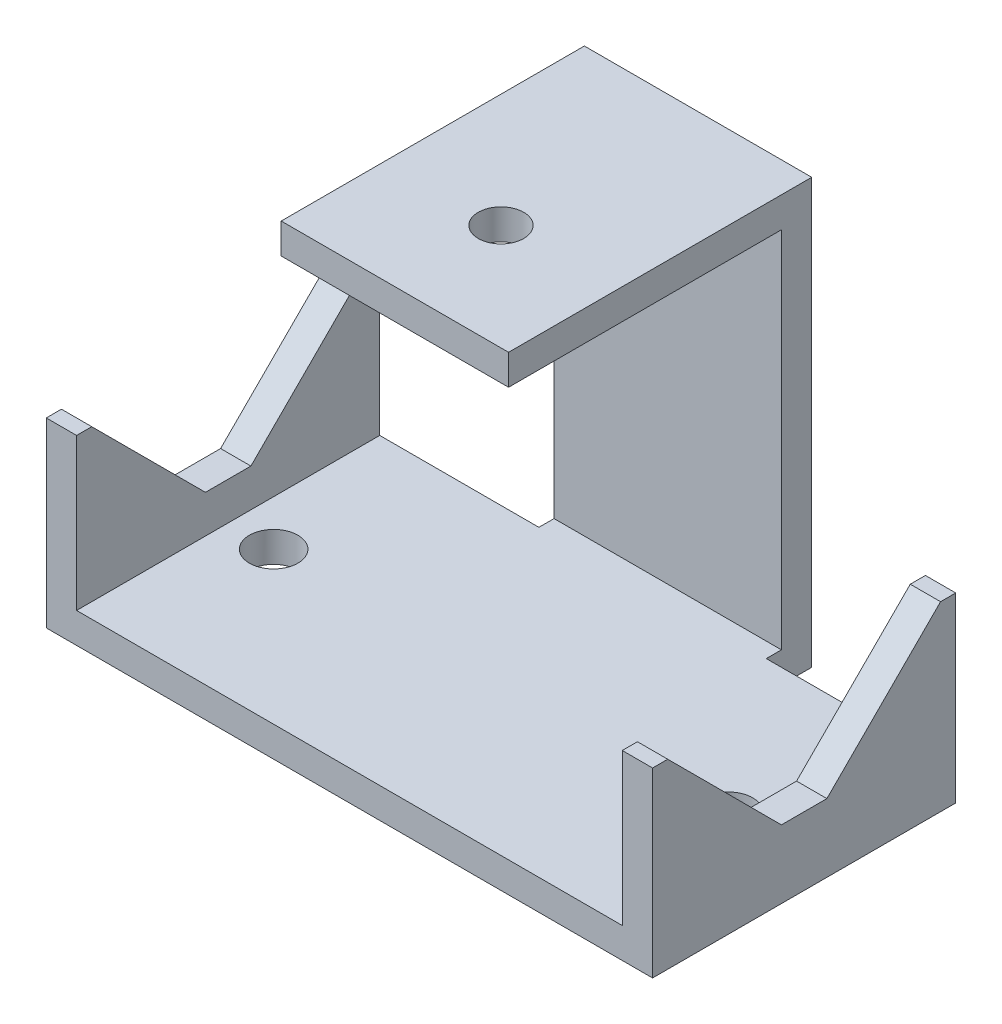
ISO-10303-21;
HEADER;
FILE_DESCRIPTION(('STEP AP214'),'2;1');
FILE_NAME('part.step','',(''),(''),'','','');
FILE_SCHEMA(('AUTOMOTIVE_DESIGN { 1 0 10303 214 1 1 1 1 }'));
ENDSEC;
DATA;
#1=APPLICATION_CONTEXT('core data for automotive mechanical design processes');
#2=APPLICATION_PROTOCOL_DEFINITION('international standard','automotive_design',2000,#1);
#3=PRODUCT_CONTEXT('',#1,'mechanical');
#4=PRODUCT('Part','Part','',(#3));
#5=PRODUCT_RELATED_PRODUCT_CATEGORY('part','',(#4));
#6=PRODUCT_DEFINITION_FORMATION('','',#4);
#7=PRODUCT_DEFINITION_CONTEXT('part definition',#1,'design');
#8=PRODUCT_DEFINITION('design','',#6,#7);
#9=PRODUCT_DEFINITION_SHAPE('','',#8);
#10=(LENGTH_UNIT() NAMED_UNIT(*) SI_UNIT(.MILLI.,.METRE.));
#11=(NAMED_UNIT(*) PLANE_ANGLE_UNIT() SI_UNIT($,.RADIAN.));
#12=(NAMED_UNIT(*) SI_UNIT($,.STERADIAN.) SOLID_ANGLE_UNIT());
#13=UNCERTAINTY_MEASURE_WITH_UNIT(LENGTH_MEASURE(1.E-05),#10,'distance_accuracy_value','');
#14=(GEOMETRIC_REPRESENTATION_CONTEXT(3) GLOBAL_UNCERTAINTY_ASSIGNED_CONTEXT((#13)) GLOBAL_UNIT_ASSIGNED_CONTEXT((#10,
#11,#12)) REPRESENTATION_CONTEXT('',''));
#15=CARTESIAN_POINT('',(0.,0.,0.));
#16=DIRECTION('',(0.,0.,1.));
#17=DIRECTION('',(1.,0.,0.));
#18=AXIS2_PLACEMENT_3D('',#15,#16,#17);
#19=CARTESIAN_POINT('',(0.,0.,-11.));
#20=DIRECTION('',(0.,0.,1.));
#21=DIRECTION('',(1.,0.,0.));
#22=AXIS2_PLACEMENT_3D('',#19,#20,#21);
#23=PLANE('',#22);
#24=DIRECTION('',(0.,-1.,0.));
#25=VECTOR('',#24,1.);
#26=CARTESIAN_POINT('',(7.5,0.,-11.));
#27=LINE('',#26,#25);
#28=CARTESIAN_POINT('',(7.5,26.,-11.));
#29=VERTEX_POINT('',#28);
#30=CARTESIAN_POINT('',(7.5,2.,-11.));
#31=VERTEX_POINT('',#30);
#32=EDGE_CURVE('E320',#29,#31,#27,.T.);
#33=ORIENTED_EDGE('',*,*,#32,.F.);
#34=DIRECTION('',(-1.,0.,0.));
#35=VECTOR('',#34,1.);
#36=CARTESIAN_POINT('',(0.,26.,-11.));
#37=LINE('',#36,#35);
#38=CARTESIAN_POINT('',(-7.5,26.,-11.));
#39=VERTEX_POINT('',#38);
#40=EDGE_CURVE('E11',#29,#39,#37,.T.);
#41=ORIENTED_EDGE('',*,*,#40,.T.);
#42=DIRECTION('',(0.,1.,0.));
#43=VECTOR('',#42,1.);
#44=CARTESIAN_POINT('',(-7.5,0.,-11.));
#45=LINE('',#44,#43);
#46=CARTESIAN_POINT('',(-7.5,2.,-11.));
#47=VERTEX_POINT('',#46);
#48=EDGE_CURVE('E199',#47,#39,#45,.T.);
#49=ORIENTED_EDGE('',*,*,#48,.F.);
#50=DIRECTION('',(-1.,0.,0.));
#51=VECTOR('',#50,1.);
#52=CARTESIAN_POINT('',(0.,2.,-11.));
#53=LINE('',#52,#51);
#54=EDGE_CURVE('E329',#31,#47,#53,.T.);
#55=ORIENTED_EDGE('',*,*,#54,.F.);
#56=EDGE_LOOP('',(#33,#41,#49,#55));
#57=FACE_BOUND('',#56,.T.);
#58=ADVANCED_FACE('F32',(#57),#23,.T.);
#59=CARTESIAN_POINT('',(20.,2.,10.));
#60=DIRECTION('',(-1.,0.,0.));
#61=DIRECTION('',(0.,0.,1.));
#62=AXIS2_PLACEMENT_3D('',#59,#60,#61);
#63=PLANE('',#62);
#64=DIRECTION('',(0.,0.,-1.));
#65=VECTOR('',#64,1.);
#66=CARTESIAN_POINT('',(20.,0.,10.));
#67=LINE('',#66,#65);
#68=CARTESIAN_POINT('',(20.,0.,10.));
#69=VERTEX_POINT('',#68);
#70=CARTESIAN_POINT('',(20.,0.,-10.));
#71=VERTEX_POINT('',#70);
#72=EDGE_CURVE('E332',#69,#71,#67,.T.);
#73=ORIENTED_EDGE('',*,*,#72,.T.);
#74=DIRECTION('',(0.,-1.,0.));
#75=VECTOR('',#74,1.);
#76=CARTESIAN_POINT('',(20.,2.,-10.));
#77=LINE('',#76,#75);
#78=CARTESIAN_POINT('',(20.,12.,-10.));
#79=VERTEX_POINT('',#78);
#80=EDGE_CURVE('E40',#79,#71,#77,.T.);
#81=ORIENTED_EDGE('',*,*,#80,.F.);
#82=DIRECTION('',(0.,0.,-1.));
#83=VECTOR('',#82,1.);
#84=CARTESIAN_POINT('',(20.,12.,-10.));
#85=LINE('',#84,#83);
#86=CARTESIAN_POINT('',(20.,12.,-9.));
#87=VERTEX_POINT('',#86);
#88=EDGE_CURVE('E222',#87,#79,#85,.T.);
#89=ORIENTED_EDGE('',*,*,#88,.F.);
#90=DIRECTION('',(0.,0.70710678118655,-0.707106781186545));
#91=VECTOR('',#90,1.);
#92=CARTESIAN_POINT('',(20.,12.,-9.));
#93=LINE('',#92,#91);
#94=CARTESIAN_POINT('',(20.,4.49999999999995,-1.5));
#95=VERTEX_POINT('',#94);
#96=EDGE_CURVE('E243',#95,#87,#93,.T.);
#97=ORIENTED_EDGE('',*,*,#96,.F.);
#98=DIRECTION('',(0.,0.,-1.));
#99=VECTOR('',#98,1.);
#100=CARTESIAN_POINT('',(20.,4.49999999999995,-1.5));
#101=LINE('',#100,#99);
#102=CARTESIAN_POINT('',(20.,4.49999999999995,1.5));
#103=VERTEX_POINT('',#102);
#104=EDGE_CURVE('E245',#103,#95,#101,.T.);
#105=ORIENTED_EDGE('',*,*,#104,.F.);
#106=DIRECTION('',(0.,-0.70710678118655,-0.707106781186545));
#107=VECTOR('',#106,1.);
#108=CARTESIAN_POINT('',(20.,4.49999999999995,1.5));
#109=LINE('',#108,#107);
#110=CARTESIAN_POINT('',(20.,12.,9.));
#111=VERTEX_POINT('',#110);
#112=EDGE_CURVE('E247',#111,#103,#109,.T.);
#113=ORIENTED_EDGE('',*,*,#112,.F.);
#114=DIRECTION('',(0.,0.,-1.));
#115=VECTOR('',#114,1.);
#116=CARTESIAN_POINT('',(20.,12.,9.));
#117=LINE('',#116,#115);
#118=CARTESIAN_POINT('',(20.,12.,10.));
#119=VERTEX_POINT('',#118);
#120=EDGE_CURVE('E228',#119,#111,#117,.T.);
#121=ORIENTED_EDGE('',*,*,#120,.F.);
#122=DIRECTION('',(0.,-1.,0.));
#123=VECTOR('',#122,1.);
#124=CARTESIAN_POINT('',(20.,2.,10.));
#125=LINE('',#124,#123);
#126=EDGE_CURVE('E344',#119,#69,#125,.T.);
#127=ORIENTED_EDGE('',*,*,#126,.T.);
#128=EDGE_LOOP('',(#73,#81,#89,#97,#105,#113,#121,#127));
#129=FACE_BOUND('',#128,.T.);
#130=ADVANCED_FACE('F34',(#129),#63,.F.);
#131=CARTESIAN_POINT('',(7.5,2.,-10.));
#132=DIRECTION('',(0.,0.,1.));
#133=DIRECTION('',(1.,0.,0.));
#134=AXIS2_PLACEMENT_3D('',#131,#132,#133);
#135=PLANE('',#134);
#136=DIRECTION('',(-1.,0.,0.));
#137=VECTOR('',#136,1.);
#138=CARTESIAN_POINT('',(7.5,2.,-10.));
#139=LINE('',#138,#137);
#140=CARTESIAN_POINT('',(18.,2.,-10.));
#141=VERTEX_POINT('',#140);
#142=CARTESIAN_POINT('',(7.5,2.,-10.));
#143=VERTEX_POINT('',#142);
#144=EDGE_CURVE('E333',#141,#143,#139,.T.);
#145=ORIENTED_EDGE('',*,*,#144,.F.);
#146=DIRECTION('',(0.,-1.,0.));
#147=VECTOR('',#146,1.);
#148=CARTESIAN_POINT('',(18.,0.,-10.));
#149=LINE('',#148,#147);
#150=CARTESIAN_POINT('',(18.,12.,-10.));
#151=VERTEX_POINT('',#150);
#152=EDGE_CURVE('E224',#151,#141,#149,.T.);
#153=ORIENTED_EDGE('',*,*,#152,.F.);
#154=DIRECTION('',(1.,0.,0.));
#155=VECTOR('',#154,1.);
#156=CARTESIAN_POINT('',(18.,12.,-10.));
#157=LINE('',#156,#155);
#158=EDGE_CURVE('E240',#151,#79,#157,.T.);
#159=ORIENTED_EDGE('',*,*,#158,.T.);
#160=ORIENTED_EDGE('',*,*,#80,.T.);
#161=DIRECTION('',(-1.,0.,0.));
#162=VECTOR('',#161,1.);
#163=CARTESIAN_POINT('',(7.5,0.,-10.));
#164=LINE('',#163,#162);
#165=CARTESIAN_POINT('',(7.5,0.,-10.));
#166=VERTEX_POINT('',#165);
#167=EDGE_CURVE('E347',#71,#166,#164,.T.);
#168=ORIENTED_EDGE('',*,*,#167,.T.);
#169=DIRECTION('',(0.,-1.,0.));
#170=VECTOR('',#169,1.);
#171=CARTESIAN_POINT('',(7.5,2.,-10.));
#172=LINE('',#171,#170);
#173=EDGE_CURVE('E377',#143,#166,#172,.T.);
#174=ORIENTED_EDGE('',*,*,#173,.F.);
#175=EDGE_LOOP('',(#145,#153,#159,#160,#168,#174));
#176=FACE_BOUND('',#175,.T.);
#177=ADVANCED_FACE('F381',(#176),#135,.F.);
#178=CARTESIAN_POINT('',(7.5,2.,-13.));
#179=DIRECTION('',(-1.,0.,0.));
#180=DIRECTION('',(0.,0.,1.));
#181=AXIS2_PLACEMENT_3D('',#178,#179,#180);
#182=PLANE('',#181);
#183=DIRECTION('',(0.,0.,-1.));
#184=VECTOR('',#183,1.);
#185=CARTESIAN_POINT('',(7.5,28.,-11.));
#186=LINE('',#185,#184);
#187=CARTESIAN_POINT('',(7.5,28.,7.));
#188=VERTEX_POINT('',#187);
#189=CARTESIAN_POINT('',(7.5,28.,-13.));
#190=VERTEX_POINT('',#189);
#191=EDGE_CURVE('E326',#188,#190,#186,.T.);
#192=ORIENTED_EDGE('',*,*,#191,.F.);
#193=DIRECTION('',(0.,1.,0.));
#194=VECTOR('',#193,1.);
#195=CARTESIAN_POINT('',(7.5,26.,7.));
#196=LINE('',#195,#194);
#197=CARTESIAN_POINT('',(7.5,26.,7.));
#198=VERTEX_POINT('',#197);
#199=EDGE_CURVE('E210',#198,#188,#196,.T.);
#200=ORIENTED_EDGE('',*,*,#199,.F.);
#201=DIRECTION('',(0.,0.,-1.));
#202=VECTOR('',#201,1.);
#203=CARTESIAN_POINT('',(7.5,26.,-13.));
#204=LINE('',#203,#202);
#205=EDGE_CURVE('E211',#198,#29,#204,.T.);
#206=ORIENTED_EDGE('',*,*,#205,.T.);
#207=ORIENTED_EDGE('',*,*,#32,.T.);
#208=DIRECTION('',(0.,0.,-1.));
#209=VECTOR('',#208,1.);
#210=CARTESIAN_POINT('',(7.5,2.,-13.));
#211=LINE('',#210,#209);
#212=EDGE_CURVE('E335',#143,#31,#211,.T.);
#213=ORIENTED_EDGE('',*,*,#212,.F.);
#214=ORIENTED_EDGE('',*,*,#173,.T.);
#215=DIRECTION('',(0.,0.,-1.));
#216=VECTOR('',#215,1.);
#217=CARTESIAN_POINT('',(7.5,0.,-13.));
#218=LINE('',#217,#216);
#219=CARTESIAN_POINT('',(7.5,0.,-13.));
#220=VERTEX_POINT('',#219);
#221=EDGE_CURVE('E349',#166,#220,#218,.T.);
#222=ORIENTED_EDGE('',*,*,#221,.T.);
#223=DIRECTION('',(0.,-1.,0.));
#224=VECTOR('',#223,1.);
#225=CARTESIAN_POINT('',(7.5,2.,-13.));
#226=LINE('',#225,#224);
#227=EDGE_CURVE('E375',#190,#220,#226,.T.);
#228=ORIENTED_EDGE('',*,*,#227,.F.);
#229=EDGE_LOOP('',(#192,#200,#206,#207,#213,#214,#222,#228));
#230=FACE_BOUND('',#229,.T.);
#231=ADVANCED_FACE('F397',(#230),#182,.F.);
#232=CARTESIAN_POINT('',(-7.5,2.,-13.));
#233=DIRECTION('',(0.,0.,1.));
#234=DIRECTION('',(1.,0.,0.));
#235=AXIS2_PLACEMENT_3D('',#232,#233,#234);
#236=PLANE('',#235);
#237=ORIENTED_EDGE('',*,*,#227,.T.);
#238=DIRECTION('',(-1.,0.,0.));
#239=VECTOR('',#238,1.);
#240=CARTESIAN_POINT('',(-7.5,0.,-13.));
#241=LINE('',#240,#239);
#242=CARTESIAN_POINT('',(-7.5,0.,-13.));
#243=VERTEX_POINT('',#242);
#244=EDGE_CURVE('E352',#220,#243,#241,.T.);
#245=ORIENTED_EDGE('',*,*,#244,.T.);
#246=DIRECTION('',(0.,-1.,0.));
#247=VECTOR('',#246,1.);
#248=CARTESIAN_POINT('',(-7.5,2.,-13.));
#249=LINE('',#248,#247);
#250=CARTESIAN_POINT('',(-7.5,28.,-13.));
#251=VERTEX_POINT('',#250);
#252=EDGE_CURVE('E373',#251,#243,#249,.T.);
#253=ORIENTED_EDGE('',*,*,#252,.F.);
#254=DIRECTION('',(1.,0.,0.));
#255=VECTOR('',#254,1.);
#256=CARTESIAN_POINT('',(7.5,28.,-13.));
#257=LINE('',#256,#255);
#258=EDGE_CURVE('E319',#251,#190,#257,.T.);
#259=ORIENTED_EDGE('',*,*,#258,.T.);
#260=EDGE_LOOP('',(#237,#245,#253,#259));
#261=FACE_BOUND('',#260,.T.);
#262=ADVANCED_FACE('F438',(#261),#236,.F.);
#263=CARTESIAN_POINT('',(-7.5,2.,-13.));
#264=DIRECTION('',(1.,0.,0.));
#265=DIRECTION('',(0.,0.,-1.));
#266=AXIS2_PLACEMENT_3D('',#263,#264,#265);
#267=PLANE('',#266);
#268=ORIENTED_EDGE('',*,*,#252,.T.);
#269=DIRECTION('',(0.,0.,1.));
#270=VECTOR('',#269,1.);
#271=CARTESIAN_POINT('',(-7.5,0.,-13.));
#272=LINE('',#271,#270);
#273=CARTESIAN_POINT('',(-7.5,0.,-10.));
#274=VERTEX_POINT('',#273);
#275=EDGE_CURVE('E355',#243,#274,#272,.T.);
#276=ORIENTED_EDGE('',*,*,#275,.T.);
#277=DIRECTION('',(0.,-1.,0.));
#278=VECTOR('',#277,1.);
#279=CARTESIAN_POINT('',(-7.5,2.,-10.));
#280=LINE('',#279,#278);
#281=CARTESIAN_POINT('',(-7.5,2.,-10.));
#282=VERTEX_POINT('',#281);
#283=EDGE_CURVE('E370',#282,#274,#280,.T.);
#284=ORIENTED_EDGE('',*,*,#283,.F.);
#285=DIRECTION('',(0.,0.,1.));
#286=VECTOR('',#285,1.);
#287=CARTESIAN_POINT('',(-7.5,2.,-13.));
#288=LINE('',#287,#286);
#289=EDGE_CURVE('E339',#47,#282,#288,.T.);
#290=ORIENTED_EDGE('',*,*,#289,.F.);
#291=ORIENTED_EDGE('',*,*,#48,.T.);
#292=DIRECTION('',(0.,0.,1.));
#293=VECTOR('',#292,1.);
#294=CARTESIAN_POINT('',(-7.5,26.,-13.));
#295=LINE('',#294,#293);
#296=CARTESIAN_POINT('',(-7.5,26.,7.));
#297=VERTEX_POINT('',#296);
#298=EDGE_CURVE('E191',#39,#297,#295,.T.);
#299=ORIENTED_EDGE('',*,*,#298,.T.);
#300=DIRECTION('',(0.,1.,0.));
#301=VECTOR('',#300,1.);
#302=CARTESIAN_POINT('',(-7.5,26.,7.));
#303=LINE('',#302,#301);
#304=CARTESIAN_POINT('',(-7.5,28.,7.));
#305=VERTEX_POINT('',#304);
#306=EDGE_CURVE('E195',#297,#305,#303,.T.);
#307=ORIENTED_EDGE('',*,*,#306,.T.);
#308=DIRECTION('',(0.,0.,-1.));
#309=VECTOR('',#308,1.);
#310=CARTESIAN_POINT('',(-7.5,28.,-11.));
#311=LINE('',#310,#309);
#312=EDGE_CURVE('E323',#305,#251,#311,.T.);
#313=ORIENTED_EDGE('',*,*,#312,.T.);
#314=EDGE_LOOP('',(#268,#276,#284,#290,#291,#299,#307,#313));
#315=FACE_BOUND('',#314,.T.);
#316=ADVANCED_FACE('F193',(#315),#267,.F.);
#317=CARTESIAN_POINT('',(-20.,2.,-10.));
#318=DIRECTION('',(0.,0.,1.));
#319=DIRECTION('',(1.,0.,0.));
#320=AXIS2_PLACEMENT_3D('',#317,#318,#319);
#321=PLANE('',#320);
#322=DIRECTION('',(-1.,0.,0.));
#323=VECTOR('',#322,1.);
#324=CARTESIAN_POINT('',(-20.,0.,-10.));
#325=LINE('',#324,#323);
#326=CARTESIAN_POINT('',(-20.,0.,-10.));
#327=VERTEX_POINT('',#326);
#328=EDGE_CURVE('E357',#274,#327,#325,.T.);
#329=ORIENTED_EDGE('',*,*,#328,.T.);
#330=DIRECTION('',(0.,-1.,0.));
#331=VECTOR('',#330,1.);
#332=CARTESIAN_POINT('',(-20.,2.,-10.));
#333=LINE('',#332,#331);
#334=CARTESIAN_POINT('',(-20.,12.,-10.));
#335=VERTEX_POINT('',#334);
#336=EDGE_CURVE('E367',#335,#327,#333,.T.);
#337=ORIENTED_EDGE('',*,*,#336,.F.);
#338=DIRECTION('',(-1.,0.,0.));
#339=VECTOR('',#338,1.);
#340=CARTESIAN_POINT('',(-18.,12.,-10.));
#341=LINE('',#340,#339);
#342=CARTESIAN_POINT('',(-18.,12.,-10.));
#343=VERTEX_POINT('',#342);
#344=EDGE_CURVE('E304',#343,#335,#341,.T.);
#345=ORIENTED_EDGE('',*,*,#344,.F.);
#346=DIRECTION('',(0.,-1.,0.));
#347=VECTOR('',#346,1.);
#348=CARTESIAN_POINT('',(-18.,0.,-10.));
#349=LINE('',#348,#347);
#350=CARTESIAN_POINT('',(-18.,2.,-10.));
#351=VERTEX_POINT('',#350);
#352=EDGE_CURVE('E269',#343,#351,#349,.T.);
#353=ORIENTED_EDGE('',*,*,#352,.T.);
#354=DIRECTION('',(-1.,0.,0.));
#355=VECTOR('',#354,1.);
#356=CARTESIAN_POINT('',(-20.,2.,-10.));
#357=LINE('',#356,#355);
#358=EDGE_CURVE('E341',#282,#351,#357,.T.);
#359=ORIENTED_EDGE('',*,*,#358,.F.);
#360=ORIENTED_EDGE('',*,*,#283,.T.);
#361=EDGE_LOOP('',(#329,#337,#345,#353,#359,#360));
#362=FACE_BOUND('',#361,.T.);
#363=ADVANCED_FACE('F433',(#362),#321,.F.);
#364=CARTESIAN_POINT('',(-20.,2.,10.));
#365=DIRECTION('',(1.,0.,0.));
#366=DIRECTION('',(0.,0.,-1.));
#367=AXIS2_PLACEMENT_3D('',#364,#365,#366);
#368=PLANE('',#367);
#369=DIRECTION('',(0.,0.,1.));
#370=VECTOR('',#369,1.);
#371=CARTESIAN_POINT('',(-20.,0.,10.));
#372=LINE('',#371,#370);
#373=CARTESIAN_POINT('',(-20.,0.,10.));
#374=VERTEX_POINT('',#373);
#375=EDGE_CURVE('E359',#327,#374,#372,.T.);
#376=ORIENTED_EDGE('',*,*,#375,.T.);
#377=DIRECTION('',(0.,-1.,0.));
#378=VECTOR('',#377,1.);
#379=CARTESIAN_POINT('',(-20.,2.,10.));
#380=LINE('',#379,#378);
#381=CARTESIAN_POINT('',(-20.,12.,10.));
#382=VERTEX_POINT('',#381);
#383=EDGE_CURVE('E364',#382,#374,#380,.T.);
#384=ORIENTED_EDGE('',*,*,#383,.F.);
#385=DIRECTION('',(0.,0.,-1.));
#386=VECTOR('',#385,1.);
#387=CARTESIAN_POINT('',(-20.,12.,9.));
#388=LINE('',#387,#386);
#389=CARTESIAN_POINT('',(-20.,12.,9.));
#390=VERTEX_POINT('',#389);
#391=EDGE_CURVE('E268',#382,#390,#388,.T.);
#392=ORIENTED_EDGE('',*,*,#391,.T.);
#393=DIRECTION('',(0.,-0.70710678118655,-0.707106781186545));
#394=VECTOR('',#393,1.);
#395=CARTESIAN_POINT('',(-20.,4.49999999999995,1.5));
#396=LINE('',#395,#394);
#397=CARTESIAN_POINT('',(-20.,4.49999999999995,1.5));
#398=VERTEX_POINT('',#397);
#399=EDGE_CURVE('E293',#390,#398,#396,.T.);
#400=ORIENTED_EDGE('',*,*,#399,.T.);
#401=DIRECTION('',(0.,0.,-1.));
#402=VECTOR('',#401,1.);
#403=CARTESIAN_POINT('',(-20.,4.49999999999995,-1.5));
#404=LINE('',#403,#402);
#405=CARTESIAN_POINT('',(-20.,4.49999999999995,-1.5));
#406=VERTEX_POINT('',#405);
#407=EDGE_CURVE('E296',#398,#406,#404,.T.);
#408=ORIENTED_EDGE('',*,*,#407,.T.);
#409=DIRECTION('',(0.,0.70710678118655,-0.707106781186545));
#410=VECTOR('',#409,1.);
#411=CARTESIAN_POINT('',(-20.,12.,-9.));
#412=LINE('',#411,#410);
#413=CARTESIAN_POINT('',(-20.,12.,-9.));
#414=VERTEX_POINT('',#413);
#415=EDGE_CURVE('E299',#406,#414,#412,.T.);
#416=ORIENTED_EDGE('',*,*,#415,.T.);
#417=DIRECTION('',(0.,0.,-1.));
#418=VECTOR('',#417,1.);
#419=CARTESIAN_POINT('',(-20.,12.,-10.));
#420=LINE('',#419,#418);
#421=EDGE_CURVE('E273',#414,#335,#420,.T.);
#422=ORIENTED_EDGE('',*,*,#421,.T.);
#423=ORIENTED_EDGE('',*,*,#336,.T.);
#424=EDGE_LOOP('',(#376,#384,#392,#400,#408,#416,#422,#423));
#425=FACE_BOUND('',#424,.T.);
#426=ADVANCED_FACE('F430',(#425),#368,.F.);
#427=CARTESIAN_POINT('',(-20.,2.,10.));
#428=DIRECTION('',(0.,0.,-1.));
#429=DIRECTION('',(-1.,0.,0.));
#430=AXIS2_PLACEMENT_3D('',#427,#428,#429);
#431=PLANE('',#430);
#432=DIRECTION('',(1.,0.,0.));
#433=VECTOR('',#432,1.);
#434=CARTESIAN_POINT('',(-20.,0.,10.));
#435=LINE('',#434,#433);
#436=EDGE_CURVE('E336',#374,#69,#435,.T.);
#437=ORIENTED_EDGE('',*,*,#436,.T.);
#438=ORIENTED_EDGE('',*,*,#126,.F.);
#439=DIRECTION('',(1.,0.,0.));
#440=VECTOR('',#439,1.);
#441=CARTESIAN_POINT('',(18.,12.,10.));
#442=LINE('',#441,#440);
#443=CARTESIAN_POINT('',(18.,12.,10.));
#444=VERTEX_POINT('',#443);
#445=EDGE_CURVE('E250',#444,#119,#442,.T.);
#446=ORIENTED_EDGE('',*,*,#445,.F.);
#447=DIRECTION('',(0.,1.,0.));
#448=VECTOR('',#447,1.);
#449=CARTESIAN_POINT('',(18.,0.,10.));
#450=LINE('',#449,#448);
#451=CARTESIAN_POINT('',(18.,2.,10.));
#452=VERTEX_POINT('',#451);
#453=EDGE_CURVE('E238',#452,#444,#450,.T.);
#454=ORIENTED_EDGE('',*,*,#453,.F.);
#455=DIRECTION('',(1.,0.,0.));
#456=VECTOR('',#455,1.);
#457=CARTESIAN_POINT('',(-20.,2.,10.));
#458=LINE('',#457,#456);
#459=CARTESIAN_POINT('',(-18.,2.,10.));
#460=VERTEX_POINT('',#459);
#461=EDGE_CURVE('E52',#460,#452,#458,.T.);
#462=ORIENTED_EDGE('',*,*,#461,.F.);
#463=DIRECTION('',(0.,1.,0.));
#464=VECTOR('',#463,1.);
#465=CARTESIAN_POINT('',(-18.,0.,10.));
#466=LINE('',#465,#464);
#467=CARTESIAN_POINT('',(-18.,12.,10.));
#468=VERTEX_POINT('',#467);
#469=EDGE_CURVE('E272',#460,#468,#466,.T.);
#470=ORIENTED_EDGE('',*,*,#469,.T.);
#471=DIRECTION('',(-1.,0.,0.));
#472=VECTOR('',#471,1.);
#473=CARTESIAN_POINT('',(-18.,12.,10.));
#474=LINE('',#473,#472);
#475=EDGE_CURVE('E290',#468,#382,#474,.T.);
#476=ORIENTED_EDGE('',*,*,#475,.T.);
#477=ORIENTED_EDGE('',*,*,#383,.T.);
#478=EDGE_LOOP('',(#437,#438,#446,#454,#462,#470,#476,#477));
#479=FACE_BOUND('',#478,.T.);
#480=ADVANCED_FACE('F426',(#479),#431,.F.);
#481=CARTESIAN_POINT('',(0.,2.,0.));
#482=DIRECTION('',(0.,-1.,0.));
#483=DIRECTION('',(0.,0.,-1.));
#484=AXIS2_PLACEMENT_3D('',#481,#482,#483);
#485=PLANE('',#484);
#486=CARTESIAN_POINT('',(-15.,2.,0.));
#487=DIRECTION('',(0.,1.,0.));
#488=DIRECTION('',(0.,0.,1.));
#489=AXIS2_PLACEMENT_3D('',#486,#487,#488);
#490=CIRCLE('',#489,1.6);
#491=CARTESIAN_POINT('',(-15.,2.,1.6));
#492=VERTEX_POINT('',#491);
#493=EDGE_CURVE('E221',#492,#492,#490,.T.);
#494=ORIENTED_EDGE('',*,*,#493,.F.);
#495=EDGE_LOOP('',(#494));
#496=FACE_BOUND('',#495,.T.);
#497=CARTESIAN_POINT('',(15.,2.,0.));
#498=DIRECTION('',(0.,1.,0.));
#499=DIRECTION('',(0.,0.,1.));
#500=AXIS2_PLACEMENT_3D('',#497,#498,#499);
#501=CIRCLE('',#500,1.6);
#502=CARTESIAN_POINT('',(15.,2.,1.6));
#503=VERTEX_POINT('',#502);
#504=EDGE_CURVE('E722',#503,#503,#501,.T.);
#505=ORIENTED_EDGE('',*,*,#504,.F.);
#506=EDGE_LOOP('',(#505));
#507=FACE_BOUND('',#506,.T.);
#508=ORIENTED_EDGE('',*,*,#461,.T.);
#509=DIRECTION('',(0.,0.,-1.));
#510=VECTOR('',#509,1.);
#511=CARTESIAN_POINT('',(18.,2.,0.));
#512=LINE('',#511,#510);
#513=EDGE_CURVE('E47',#452,#141,#512,.T.);
#514=ORIENTED_EDGE('',*,*,#513,.T.);
#515=ORIENTED_EDGE('',*,*,#144,.T.);
#516=ORIENTED_EDGE('',*,*,#212,.T.);
#517=ORIENTED_EDGE('',*,*,#54,.T.);
#518=ORIENTED_EDGE('',*,*,#289,.T.);
#519=ORIENTED_EDGE('',*,*,#358,.T.);
#520=DIRECTION('',(0.,0.,1.));
#521=VECTOR('',#520,1.);
#522=CARTESIAN_POINT('',(-18.,2.,0.));
#523=LINE('',#522,#521);
#524=EDGE_CURVE('E307',#351,#460,#523,.T.);
#525=ORIENTED_EDGE('',*,*,#524,.T.);
#526=EDGE_LOOP('',(#508,#514,#515,#516,#517,#518,#519,#525));
#527=FACE_BOUND('',#526,.T.);
#528=ADVANCED_FACE('F444',(#496,#507,#527),#485,.F.);
#529=CARTESIAN_POINT('',(0.,0.,0.));
#530=DIRECTION('',(0.,-1.,0.));
#531=DIRECTION('',(0.,0.,-1.));
#532=AXIS2_PLACEMENT_3D('',#529,#530,#531);
#533=PLANE('',#532);
#534=CARTESIAN_POINT('',(-15.,0.,0.));
#535=DIRECTION('',(0.,-1.,0.));
#536=DIRECTION('',(0.,0.,-1.));
#537=AXIS2_PLACEMENT_3D('',#534,#535,#536);
#538=CIRCLE('',#537,1.6);
#539=CARTESIAN_POINT('',(-15.,0.,-1.6));
#540=VERTEX_POINT('',#539);
#541=EDGE_CURVE('E727',#540,#540,#538,.F.);
#542=ORIENTED_EDGE('',*,*,#541,.T.);
#543=EDGE_LOOP('',(#542));
#544=FACE_BOUND('',#543,.T.);
#545=CARTESIAN_POINT('',(15.,0.,0.));
#546=DIRECTION('',(0.,-1.,0.));
#547=DIRECTION('',(0.,0.,-1.));
#548=AXIS2_PLACEMENT_3D('',#545,#546,#547);
#549=CIRCLE('',#548,1.6);
#550=CARTESIAN_POINT('',(15.,0.,-1.6));
#551=VERTEX_POINT('',#550);
#552=EDGE_CURVE('E719',#551,#551,#549,.F.);
#553=ORIENTED_EDGE('',*,*,#552,.T.);
#554=EDGE_LOOP('',(#553));
#555=FACE_BOUND('',#554,.T.);
#556=ORIENTED_EDGE('',*,*,#221,.F.);
#557=ORIENTED_EDGE('',*,*,#167,.F.);
#558=ORIENTED_EDGE('',*,*,#72,.F.);
#559=ORIENTED_EDGE('',*,*,#436,.F.);
#560=ORIENTED_EDGE('',*,*,#375,.F.);
#561=ORIENTED_EDGE('',*,*,#328,.F.);
#562=ORIENTED_EDGE('',*,*,#275,.F.);
#563=ORIENTED_EDGE('',*,*,#244,.F.);
#564=EDGE_LOOP('',(#556,#557,#558,#559,#560,#561,#562,#563));
#565=FACE_BOUND('',#564,.T.);
#566=ADVANCED_FACE('F392',(#544,#555,#565),#533,.T.);
#567=CARTESIAN_POINT('',(7.5,28.,-11.));
#568=DIRECTION('',(0.,1.,0.));
#569=DIRECTION('',(0.,0.,1.));
#570=AXIS2_PLACEMENT_3D('',#567,#568,#569);
#571=PLANE('',#570);
#572=CARTESIAN_POINT('',(0.,28.,0.));
#573=DIRECTION('',(0.,1.,0.));
#574=DIRECTION('',(0.,0.,1.));
#575=AXIS2_PLACEMENT_3D('',#572,#573,#574);
#576=CIRCLE('',#575,1.5);
#577=CARTESIAN_POINT('',(0.,28.,1.5));
#578=VERTEX_POINT('',#577);
#579=EDGE_CURVE('E715',#578,#578,#576,.T.);
#580=ORIENTED_EDGE('',*,*,#579,.F.);
#581=EDGE_LOOP('',(#580));
#582=FACE_BOUND('',#581,.T.);
#583=ORIENTED_EDGE('',*,*,#258,.F.);
#584=ORIENTED_EDGE('',*,*,#312,.F.);
#585=DIRECTION('',(1.,0.,0.));
#586=VECTOR('',#585,1.);
#587=CARTESIAN_POINT('',(-7.5,28.,7.));
#588=LINE('',#587,#586);
#589=EDGE_CURVE('E203',#305,#188,#588,.T.);
#590=ORIENTED_EDGE('',*,*,#589,.T.);
#591=ORIENTED_EDGE('',*,*,#191,.T.);
#592=EDGE_LOOP('',(#583,#584,#590,#591));
#593=FACE_BOUND('',#592,.T.);
#594=ADVANCED_FACE('F440',(#582,#593),#571,.T.);
#595=CARTESIAN_POINT('',(-18.,0.,0.));
#596=DIRECTION('',(1.,0.,0.));
#597=DIRECTION('',(0.,0.,-1.));
#598=AXIS2_PLACEMENT_3D('',#595,#596,#597);
#599=PLANE('',#598);
#600=ORIENTED_EDGE('',*,*,#524,.F.);
#601=ORIENTED_EDGE('',*,*,#352,.F.);
#602=DIRECTION('',(0.,0.,-1.));
#603=VECTOR('',#602,1.);
#604=CARTESIAN_POINT('',(-18.,12.,-10.));
#605=LINE('',#604,#603);
#606=CARTESIAN_POINT('',(-18.,12.,-9.));
#607=VERTEX_POINT('',#606);
#608=EDGE_CURVE('E287',#607,#343,#605,.T.);
#609=ORIENTED_EDGE('',*,*,#608,.F.);
#610=DIRECTION('',(0.,0.70710678118655,-0.707106781186545));
#611=VECTOR('',#610,1.);
#612=CARTESIAN_POINT('',(-18.,12.,-9.));
#613=LINE('',#612,#611);
#614=CARTESIAN_POINT('',(-18.,4.49999999999995,-1.5));
#615=VERTEX_POINT('',#614);
#616=EDGE_CURVE('E284',#615,#607,#613,.T.);
#617=ORIENTED_EDGE('',*,*,#616,.F.);
#618=DIRECTION('',(0.,0.,-1.));
#619=VECTOR('',#618,1.);
#620=CARTESIAN_POINT('',(-18.,4.49999999999995,-1.5));
#621=LINE('',#620,#619);
#622=CARTESIAN_POINT('',(-18.,4.49999999999995,1.5));
#623=VERTEX_POINT('',#622);
#624=EDGE_CURVE('E281',#623,#615,#621,.T.);
#625=ORIENTED_EDGE('',*,*,#624,.F.);
#626=DIRECTION('',(0.,-0.70710678118655,-0.707106781186545));
#627=VECTOR('',#626,1.);
#628=CARTESIAN_POINT('',(-18.,4.49999999999995,1.5));
#629=LINE('',#628,#627);
#630=CARTESIAN_POINT('',(-18.,12.,9.));
#631=VERTEX_POINT('',#630);
#632=EDGE_CURVE('E278',#631,#623,#629,.T.);
#633=ORIENTED_EDGE('',*,*,#632,.F.);
#634=DIRECTION('',(0.,0.,-1.));
#635=VECTOR('',#634,1.);
#636=CARTESIAN_POINT('',(-18.,12.,9.));
#637=LINE('',#636,#635);
#638=EDGE_CURVE('E275',#468,#631,#637,.T.);
#639=ORIENTED_EDGE('',*,*,#638,.F.);
#640=ORIENTED_EDGE('',*,*,#469,.F.);
#641=EDGE_LOOP('',(#600,#601,#609,#617,#625,#633,#639,#640));
#642=FACE_BOUND('',#641,.T.);
#643=ADVANCED_FACE('F449',(#642),#599,.T.);
#644=CARTESIAN_POINT('',(-18.,12.,-10.));
#645=DIRECTION('',(0.,1.,0.));
#646=DIRECTION('',(0.,0.,1.));
#647=AXIS2_PLACEMENT_3D('',#644,#645,#646);
#648=PLANE('',#647);
#649=ORIENTED_EDGE('',*,*,#421,.F.);
#650=DIRECTION('',(-1.,0.,0.));
#651=VECTOR('',#650,1.);
#652=CARTESIAN_POINT('',(-18.,12.,-9.));
#653=LINE('',#652,#651);
#654=EDGE_CURVE('E308',#607,#414,#653,.T.);
#655=ORIENTED_EDGE('',*,*,#654,.F.);
#656=ORIENTED_EDGE('',*,*,#608,.T.);
#657=ORIENTED_EDGE('',*,*,#344,.T.);
#658=EDGE_LOOP('',(#649,#655,#656,#657));
#659=FACE_BOUND('',#658,.T.);
#660=ADVANCED_FACE('F454',(#659),#648,.T.);
#661=CARTESIAN_POINT('',(-18.,12.,-9.));
#662=DIRECTION('',(0.,0.707106781186545,0.70710678118655));
#663=DIRECTION('',(0.,-0.70710678118655,0.707106781186545));
#664=AXIS2_PLACEMENT_3D('',#661,#662,#663);
#665=PLANE('',#664);
#666=ORIENTED_EDGE('',*,*,#415,.F.);
#667=DIRECTION('',(-1.,0.,0.));
#668=VECTOR('',#667,1.);
#669=CARTESIAN_POINT('',(-18.,4.49999999999995,-1.5));
#670=LINE('',#669,#668);
#671=EDGE_CURVE('E310',#615,#406,#670,.T.);
#672=ORIENTED_EDGE('',*,*,#671,.F.);
#673=ORIENTED_EDGE('',*,*,#616,.T.);
#674=ORIENTED_EDGE('',*,*,#654,.T.);
#675=EDGE_LOOP('',(#666,#672,#673,#674));
#676=FACE_BOUND('',#675,.T.);
#677=ADVANCED_FACE('F458',(#676),#665,.T.);
#678=CARTESIAN_POINT('',(-18.,4.49999999999995,-1.5));
#679=DIRECTION('',(0.,1.,0.));
#680=DIRECTION('',(0.,0.,1.));
#681=AXIS2_PLACEMENT_3D('',#678,#679,#680);
#682=PLANE('',#681);
#683=ORIENTED_EDGE('',*,*,#407,.F.);
#684=DIRECTION('',(-1.,0.,0.));
#685=VECTOR('',#684,1.);
#686=CARTESIAN_POINT('',(-18.,4.49999999999995,1.5));
#687=LINE('',#686,#685);
#688=EDGE_CURVE('E312',#623,#398,#687,.T.);
#689=ORIENTED_EDGE('',*,*,#688,.F.);
#690=ORIENTED_EDGE('',*,*,#624,.T.);
#691=ORIENTED_EDGE('',*,*,#671,.T.);
#692=EDGE_LOOP('',(#683,#689,#690,#691));
#693=FACE_BOUND('',#692,.T.);
#694=ADVANCED_FACE('F463',(#693),#682,.T.);
#695=CARTESIAN_POINT('',(-18.,4.49999999999995,1.5));
#696=DIRECTION('',(0.,0.707106781186545,-0.70710678118655));
#697=DIRECTION('',(0.,0.70710678118655,0.707106781186545));
#698=AXIS2_PLACEMENT_3D('',#695,#696,#697);
#699=PLANE('',#698);
#700=ORIENTED_EDGE('',*,*,#399,.F.);
#701=DIRECTION('',(-1.,0.,0.));
#702=VECTOR('',#701,1.);
#703=CARTESIAN_POINT('',(-18.,12.,9.));
#704=LINE('',#703,#702);
#705=EDGE_CURVE('E314',#631,#390,#704,.T.);
#706=ORIENTED_EDGE('',*,*,#705,.F.);
#707=ORIENTED_EDGE('',*,*,#632,.T.);
#708=ORIENTED_EDGE('',*,*,#688,.T.);
#709=EDGE_LOOP('',(#700,#706,#707,#708));
#710=FACE_BOUND('',#709,.T.);
#711=ADVANCED_FACE('F466',(#710),#699,.T.);
#712=CARTESIAN_POINT('',(-18.,12.,9.));
#713=DIRECTION('',(0.,1.,0.));
#714=DIRECTION('',(0.,0.,1.));
#715=AXIS2_PLACEMENT_3D('',#712,#713,#714);
#716=PLANE('',#715);
#717=ORIENTED_EDGE('',*,*,#391,.F.);
#718=ORIENTED_EDGE('',*,*,#475,.F.);
#719=ORIENTED_EDGE('',*,*,#638,.T.);
#720=ORIENTED_EDGE('',*,*,#705,.T.);
#721=EDGE_LOOP('',(#717,#718,#719,#720));
#722=FACE_BOUND('',#721,.T.);
#723=ADVANCED_FACE('F468',(#722),#716,.T.);
#724=CARTESIAN_POINT('',(18.,0.,0.));
#725=DIRECTION('',(-1.,0.,0.));
#726=DIRECTION('',(0.,0.,-1.));
#727=AXIS2_PLACEMENT_3D('',#724,#725,#726);
#728=PLANE('',#727);
#729=ORIENTED_EDGE('',*,*,#513,.F.);
#730=ORIENTED_EDGE('',*,*,#453,.T.);
#731=DIRECTION('',(0.,0.,-1.));
#732=VECTOR('',#731,1.);
#733=CARTESIAN_POINT('',(18.,12.,9.));
#734=LINE('',#733,#732);
#735=CARTESIAN_POINT('',(18.,12.,9.));
#736=VERTEX_POINT('',#735);
#737=EDGE_CURVE('E236',#444,#736,#734,.T.);
#738=ORIENTED_EDGE('',*,*,#737,.T.);
#739=DIRECTION('',(0.,-0.70710678118655,-0.707106781186545));
#740=VECTOR('',#739,1.);
#741=CARTESIAN_POINT('',(18.,4.49999999999995,1.5));
#742=LINE('',#741,#740);
#743=CARTESIAN_POINT('',(18.,4.49999999999995,1.5));
#744=VERTEX_POINT('',#743);
#745=EDGE_CURVE('E234',#736,#744,#742,.T.);
#746=ORIENTED_EDGE('',*,*,#745,.T.);
#747=DIRECTION('',(0.,0.,-1.));
#748=VECTOR('',#747,1.);
#749=CARTESIAN_POINT('',(18.,4.49999999999995,-1.5));
#750=LINE('',#749,#748);
#751=CARTESIAN_POINT('',(18.,4.49999999999995,-1.5));
#752=VERTEX_POINT('',#751);
#753=EDGE_CURVE('E232',#744,#752,#750,.T.);
#754=ORIENTED_EDGE('',*,*,#753,.T.);
#755=DIRECTION('',(0.,0.70710678118655,-0.707106781186545));
#756=VECTOR('',#755,1.);
#757=CARTESIAN_POINT('',(18.,12.,-9.));
#758=LINE('',#757,#756);
#759=CARTESIAN_POINT('',(18.,12.,-9.));
#760=VERTEX_POINT('',#759);
#761=EDGE_CURVE('E230',#752,#760,#758,.T.);
#762=ORIENTED_EDGE('',*,*,#761,.T.);
#763=DIRECTION('',(0.,0.,-1.));
#764=VECTOR('',#763,1.);
#765=CARTESIAN_POINT('',(18.,12.,-10.));
#766=LINE('',#765,#764);
#767=EDGE_CURVE('E227',#760,#151,#766,.T.);
#768=ORIENTED_EDGE('',*,*,#767,.T.);
#769=ORIENTED_EDGE('',*,*,#152,.T.);
#770=EDGE_LOOP('',(#729,#730,#738,#746,#754,#762,#768,#769));
#771=FACE_BOUND('',#770,.T.);
#772=ADVANCED_FACE('F400',(#771),#728,.T.);
#773=CARTESIAN_POINT('',(18.,12.,9.));
#774=DIRECTION('',(0.,-1.,0.));
#775=DIRECTION('',(0.,0.,-1.));
#776=AXIS2_PLACEMENT_3D('',#773,#774,#775);
#777=PLANE('',#776);
#778=ORIENTED_EDGE('',*,*,#120,.T.);
#779=DIRECTION('',(1.,0.,0.));
#780=VECTOR('',#779,1.);
#781=CARTESIAN_POINT('',(18.,12.,9.));
#782=LINE('',#781,#780);
#783=EDGE_CURVE('E253',#736,#111,#782,.T.);
#784=ORIENTED_EDGE('',*,*,#783,.F.);
#785=ORIENTED_EDGE('',*,*,#737,.F.);
#786=ORIENTED_EDGE('',*,*,#445,.T.);
#787=EDGE_LOOP('',(#778,#784,#785,#786));
#788=FACE_BOUND('',#787,.T.);
#789=ADVANCED_FACE('F422',(#788),#777,.F.);
#790=CARTESIAN_POINT('',(18.,4.49999999999995,1.5));
#791=DIRECTION('',(0.,-0.707106781186545,0.70710678118655));
#792=DIRECTION('',(0.,-0.70710678118655,-0.707106781186545));
#793=AXIS2_PLACEMENT_3D('',#790,#791,#792);
#794=PLANE('',#793);
#795=ORIENTED_EDGE('',*,*,#112,.T.);
#796=DIRECTION('',(1.,0.,0.));
#797=VECTOR('',#796,1.);
#798=CARTESIAN_POINT('',(18.,4.49999999999995,1.5));
#799=LINE('',#798,#797);
#800=EDGE_CURVE('E256',#744,#103,#799,.T.);
#801=ORIENTED_EDGE('',*,*,#800,.F.);
#802=ORIENTED_EDGE('',*,*,#745,.F.);
#803=ORIENTED_EDGE('',*,*,#783,.T.);
#804=EDGE_LOOP('',(#795,#801,#802,#803));
#805=FACE_BOUND('',#804,.T.);
#806=ADVANCED_FACE('F419',(#805),#794,.F.);
#807=CARTESIAN_POINT('',(18.,4.49999999999995,-1.5));
#808=DIRECTION('',(0.,-1.,0.));
#809=DIRECTION('',(0.,0.,-1.));
#810=AXIS2_PLACEMENT_3D('',#807,#808,#809);
#811=PLANE('',#810);
#812=ORIENTED_EDGE('',*,*,#104,.T.);
#813=DIRECTION('',(1.,0.,0.));
#814=VECTOR('',#813,1.);
#815=CARTESIAN_POINT('',(18.,4.49999999999995,-1.5));
#816=LINE('',#815,#814);
#817=EDGE_CURVE('E259',#752,#95,#816,.T.);
#818=ORIENTED_EDGE('',*,*,#817,.F.);
#819=ORIENTED_EDGE('',*,*,#753,.F.);
#820=ORIENTED_EDGE('',*,*,#800,.T.);
#821=EDGE_LOOP('',(#812,#818,#819,#820));
#822=FACE_BOUND('',#821,.T.);
#823=ADVANCED_FACE('F415',(#822),#811,.F.);
#824=CARTESIAN_POINT('',(18.,12.,-9.));
#825=DIRECTION('',(0.,-0.707106781186545,-0.70710678118655));
#826=DIRECTION('',(0.,0.70710678118655,-0.707106781186545));
#827=AXIS2_PLACEMENT_3D('',#824,#825,#826);
#828=PLANE('',#827);
#829=ORIENTED_EDGE('',*,*,#96,.T.);
#830=DIRECTION('',(1.,0.,0.));
#831=VECTOR('',#830,1.);
#832=CARTESIAN_POINT('',(18.,12.,-9.));
#833=LINE('',#832,#831);
#834=EDGE_CURVE('E262',#760,#87,#833,.T.);
#835=ORIENTED_EDGE('',*,*,#834,.F.);
#836=ORIENTED_EDGE('',*,*,#761,.F.);
#837=ORIENTED_EDGE('',*,*,#817,.T.);
#838=EDGE_LOOP('',(#829,#835,#836,#837));
#839=FACE_BOUND('',#838,.T.);
#840=ADVANCED_FACE('F411',(#839),#828,.F.);
#841=CARTESIAN_POINT('',(18.,12.,-10.));
#842=DIRECTION('',(0.,-1.,0.));
#843=DIRECTION('',(0.,0.,-1.));
#844=AXIS2_PLACEMENT_3D('',#841,#842,#843);
#845=PLANE('',#844);
#846=ORIENTED_EDGE('',*,*,#88,.T.);
#847=ORIENTED_EDGE('',*,*,#158,.F.);
#848=ORIENTED_EDGE('',*,*,#767,.F.);
#849=ORIENTED_EDGE('',*,*,#834,.T.);
#850=EDGE_LOOP('',(#846,#847,#848,#849));
#851=FACE_BOUND('',#850,.T.);
#852=ADVANCED_FACE('F406',(#851),#845,.F.);
#853=CARTESIAN_POINT('',(-7.5,26.,7.));
#854=DIRECTION('',(0.,0.,1.));
#855=DIRECTION('',(1.,0.,0.));
#856=AXIS2_PLACEMENT_3D('',#853,#854,#855);
#857=PLANE('',#856);
#858=ORIENTED_EDGE('',*,*,#589,.F.);
#859=ORIENTED_EDGE('',*,*,#306,.F.);
#860=DIRECTION('',(1.,0.,0.));
#861=VECTOR('',#860,1.);
#862=CARTESIAN_POINT('',(-7.5,26.,7.));
#863=LINE('',#862,#861);
#864=EDGE_CURVE('E202',#297,#198,#863,.T.);
#865=ORIENTED_EDGE('',*,*,#864,.T.);
#866=ORIENTED_EDGE('',*,*,#199,.T.);
#867=EDGE_LOOP('',(#858,#859,#865,#866));
#868=FACE_BOUND('',#867,.T.);
#869=ADVANCED_FACE('F207',(#868),#857,.T.);
#870=CARTESIAN_POINT('',(0.,26.,0.));
#871=DIRECTION('',(0.,1.,0.));
#872=DIRECTION('',(0.,0.,1.));
#873=AXIS2_PLACEMENT_3D('',#870,#871,#872);
#874=PLANE('',#873);
#875=CARTESIAN_POINT('',(0.,26.,0.));
#876=DIRECTION('',(0.,1.,0.));
#877=DIRECTION('',(0.,0.,1.));
#878=AXIS2_PLACEMENT_3D('',#875,#876,#877);
#879=CIRCLE('',#878,1.5);
#880=CARTESIAN_POINT('',(0.,26.,1.5));
#881=VERTEX_POINT('',#880);
#882=EDGE_CURVE('E718',#881,#881,#879,.F.);
#883=ORIENTED_EDGE('',*,*,#882,.F.);
#884=EDGE_LOOP('',(#883));
#885=FACE_BOUND('',#884,.T.);
#886=ORIENTED_EDGE('',*,*,#40,.F.);
#887=ORIENTED_EDGE('',*,*,#205,.F.);
#888=ORIENTED_EDGE('',*,*,#864,.F.);
#889=ORIENTED_EDGE('',*,*,#298,.F.);
#890=EDGE_LOOP('',(#886,#887,#888,#889));
#891=FACE_BOUND('',#890,.T.);
#892=ADVANCED_FACE('F214',(#885,#891),#874,.F.);
#893=CARTESIAN_POINT('',(15.,-0.00100000000000013,0.));
#894=DIRECTION('',(0.,1.,0.));
#895=DIRECTION('',(0.,0.,1.));
#896=AXIS2_PLACEMENT_3D('',#893,#894,#895);
#897=CYLINDRICAL_SURFACE('',#896,1.6);
#898=ORIENTED_EDGE('',*,*,#552,.F.);
#899=EDGE_LOOP('',(#898));
#900=FACE_BOUND('',#899,.T.);
#901=ORIENTED_EDGE('',*,*,#504,.T.);
#902=EDGE_LOOP('',(#901));
#903=FACE_BOUND('',#902,.T.);
#904=ADVANCED_FACE('F674',(#900,#903),#897,.F.);
#905=CARTESIAN_POINT('',(-15.,-0.00100000000000013,0.));
#906=DIRECTION('',(0.,1.,0.));
#907=DIRECTION('',(0.,0.,1.));
#908=AXIS2_PLACEMENT_3D('',#905,#906,#907);
#909=CYLINDRICAL_SURFACE('',#908,1.6);
#910=ORIENTED_EDGE('',*,*,#541,.F.);
#911=EDGE_LOOP('',(#910));
#912=FACE_BOUND('',#911,.T.);
#913=ORIENTED_EDGE('',*,*,#493,.T.);
#914=EDGE_LOOP('',(#913));
#915=FACE_BOUND('',#914,.T.);
#916=ADVANCED_FACE('F683',(#912,#915),#909,.F.);
#917=CARTESIAN_POINT('',(0.,-0.001000000000001,0.));
#918=DIRECTION('',(0.,1.,0.));
#919=DIRECTION('',(0.,0.,1.));
#920=AXIS2_PLACEMENT_3D('',#917,#918,#919);
#921=CYLINDRICAL_SURFACE('',#920,1.5);
#922=ORIENTED_EDGE('',*,*,#579,.T.);
#923=EDGE_LOOP('',(#922));
#924=FACE_BOUND('',#923,.T.);
#925=ORIENTED_EDGE('',*,*,#882,.T.);
#926=EDGE_LOOP('',(#925));
#927=FACE_BOUND('',#926,.T.);
#928=ADVANCED_FACE('F691',(#924,#927),#921,.F.);
#929=CLOSED_SHELL('',(#58,#130,#177,#231,#262,#316,#363,#426,#480,#528,#566,#594,#643,#660,#677,
#694,#711,#723,#772,#789,#806,#823,#840,#852,#869,#892,#904,#916,#928));
#930=MANIFOLD_SOLID_BREP('B2',#929);
#931=ADVANCED_BREP_SHAPE_REPRESENTATION('',(#18,#930),#14);
#932=SHAPE_DEFINITION_REPRESENTATION(#9,#931);
ENDSEC;
END-ISO-10303-21;
